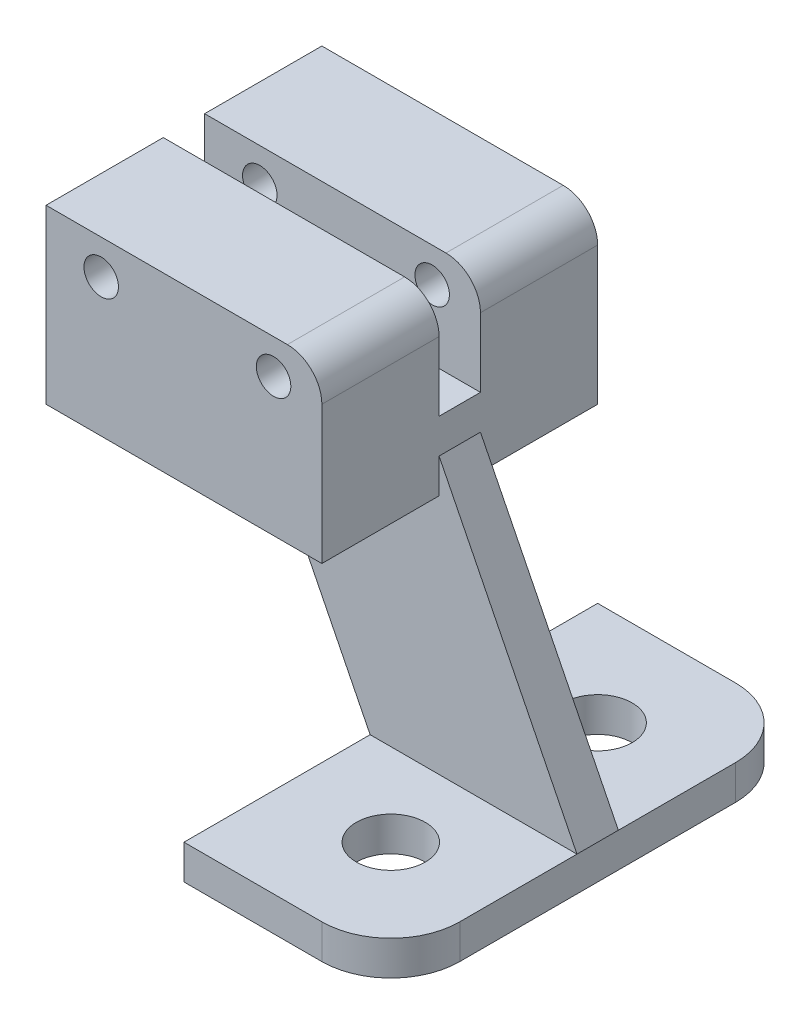
ISO-10303-21;
HEADER;
FILE_DESCRIPTION(('STEP AP214'),'2;1');
FILE_NAME('part.step','',(''),(''),'','','');
FILE_SCHEMA(('AUTOMOTIVE_DESIGN { 1 0 10303 214 1 1 1 1 }'));
ENDSEC;
DATA;
#1=APPLICATION_CONTEXT('core data for automotive mechanical design processes');
#2=APPLICATION_PROTOCOL_DEFINITION('international standard','automotive_design',2000,#1);
#3=PRODUCT_CONTEXT('',#1,'mechanical');
#4=PRODUCT('Part','Part','',(#3));
#5=PRODUCT_RELATED_PRODUCT_CATEGORY('part','',(#4));
#6=PRODUCT_DEFINITION_FORMATION('','',#4);
#7=PRODUCT_DEFINITION_CONTEXT('part definition',#1,'design');
#8=PRODUCT_DEFINITION('design','',#6,#7);
#9=PRODUCT_DEFINITION_SHAPE('','',#8);
#10=(LENGTH_UNIT() NAMED_UNIT(*) SI_UNIT(.MILLI.,.METRE.));
#11=(NAMED_UNIT(*) PLANE_ANGLE_UNIT() SI_UNIT($,.RADIAN.));
#12=(NAMED_UNIT(*) SI_UNIT($,.STERADIAN.) SOLID_ANGLE_UNIT());
#13=UNCERTAINTY_MEASURE_WITH_UNIT(LENGTH_MEASURE(1.E-05),#10,'distance_accuracy_value','');
#14=(GEOMETRIC_REPRESENTATION_CONTEXT(3) GLOBAL_UNCERTAINTY_ASSIGNED_CONTEXT((#13)) GLOBAL_UNIT_ASSIGNED_CONTEXT((#10,
#11,#12)) REPRESENTATION_CONTEXT('',''));
#15=CARTESIAN_POINT('',(0.,0.,0.));
#16=DIRECTION('',(0.,0.,1.));
#17=DIRECTION('',(1.,0.,0.));
#18=AXIS2_PLACEMENT_3D('',#15,#16,#17);
#19=CARTESIAN_POINT('',(0.,79.5806012237701,0.));
#20=DIRECTION('',(0.,1.,0.));
#21=DIRECTION('',(0.,0.,1.));
#22=AXIS2_PLACEMENT_3D('',#19,#20,#21);
#23=PLANE('',#22);
#24=DIRECTION('',(1.,0.,0.));
#25=VECTOR('',#24,1.);
#26=CARTESIAN_POINT('',(3.56486825643593,79.5806012237701,50.));
#27=LINE('',#26,#25);
#28=CARTESIAN_POINT('',(3.56486825643593,79.5806012237701,50.));
#29=VERTEX_POINT('',#28);
#30=CARTESIAN_POINT('',(38.5648682564359,79.5806012237701,50.));
#31=VERTEX_POINT('',#30);
#32=EDGE_CURVE('E263',#29,#31,#27,.T.);
#33=ORIENTED_EDGE('',*,*,#32,.T.);
#34=DIRECTION('',(0.,0.,-1.));
#35=VECTOR('',#34,1.);
#36=CARTESIAN_POINT('',(38.5648682564359,79.5806012237701,0.));
#37=LINE('',#36,#35);
#38=CARTESIAN_POINT('',(38.5648682564359,79.5806012237701,33.));
#39=VERTEX_POINT('',#38);
#40=EDGE_CURVE('E431',#31,#39,#37,.T.);
#41=ORIENTED_EDGE('',*,*,#40,.T.);
#42=DIRECTION('',(1.,0.,0.));
#43=VECTOR('',#42,1.);
#44=CARTESIAN_POINT('',(3.56486825643593,79.5806012237701,33.));
#45=LINE('',#44,#43);
#46=CARTESIAN_POINT('',(3.56486825643593,79.5806012237701,33.));
#47=VERTEX_POINT('',#46);
#48=EDGE_CURVE('E228',#47,#39,#45,.T.);
#49=ORIENTED_EDGE('',*,*,#48,.F.);
#50=DIRECTION('',(0.,0.,1.));
#51=VECTOR('',#50,1.);
#52=CARTESIAN_POINT('',(3.56486825643593,79.5806012237701,10.));
#53=LINE('',#52,#51);
#54=EDGE_CURVE('E259',#47,#29,#53,.T.);
#55=ORIENTED_EDGE('',*,*,#54,.T.);
#56=EDGE_LOOP('',(#33,#41,#49,#55));
#57=FACE_BOUND('',#56,.T.);
#58=ADVANCED_FACE('F41',(#57),#23,.T.);
#59=CARTESIAN_POINT('',(11.5648682564359,74.5806012237701,50.));
#60=DIRECTION('',(0.,0.,1.));
#61=DIRECTION('',(1.,0.,0.));
#62=AXIS2_PLACEMENT_3D('',#59,#60,#61);
#63=CYLINDRICAL_SURFACE('',#62,2.49999999999999);
#64=CARTESIAN_POINT('',(11.5648682564359,74.5806012237701,33.));
#65=DIRECTION('',(0.,0.,1.));
#66=DIRECTION('',(1.,0.,0.));
#67=AXIS2_PLACEMENT_3D('',#64,#65,#66);
#68=CIRCLE('',#67,2.49999999999999);
#69=CARTESIAN_POINT('',(14.0648682564359,74.5806012237701,33.));
#70=VERTEX_POINT('',#69);
#71=EDGE_CURVE('E239',#70,#70,#68,.F.);
#72=ORIENTED_EDGE('',*,*,#71,.T.);
#73=EDGE_LOOP('',(#72));
#74=FACE_BOUND('',#73,.T.);
#75=CARTESIAN_POINT('',(11.5648682564359,74.5806012237701,50.));
#76=DIRECTION('',(0.,0.,1.));
#77=DIRECTION('',(1.,0.,0.));
#78=AXIS2_PLACEMENT_3D('',#75,#76,#77);
#79=CIRCLE('',#78,2.49999999999999);
#80=CARTESIAN_POINT('',(14.0648682564359,74.5806012237701,50.));
#81=VERTEX_POINT('',#80);
#82=EDGE_CURVE('E248',#81,#81,#79,.T.);
#83=ORIENTED_EDGE('',*,*,#82,.T.);
#84=EDGE_LOOP('',(#83));
#85=FACE_BOUND('',#84,.T.);
#86=ADVANCED_FACE('F557',(#74,#85),#63,.F.);
#87=CARTESIAN_POINT('',(36.5648682564359,74.5806012237701,50.));
#88=DIRECTION('',(0.,0.,1.));
#89=DIRECTION('',(1.,0.,0.));
#90=AXIS2_PLACEMENT_3D('',#87,#88,#89);
#91=CYLINDRICAL_SURFACE('',#90,2.49999999999999);
#92=CARTESIAN_POINT('',(36.5648682564359,74.5806012237701,33.));
#93=DIRECTION('',(0.,0.,1.));
#94=DIRECTION('',(1.,0.,0.));
#95=AXIS2_PLACEMENT_3D('',#92,#93,#94);
#96=CIRCLE('',#95,2.49999999999999);
#97=CARTESIAN_POINT('',(39.0648682564359,74.5806012237701,33.));
#98=VERTEX_POINT('',#97);
#99=EDGE_CURVE('E238',#98,#98,#96,.F.);
#100=ORIENTED_EDGE('',*,*,#99,.T.);
#101=EDGE_LOOP('',(#100));
#102=FACE_BOUND('',#101,.T.);
#103=CARTESIAN_POINT('',(36.5648682564359,74.5806012237701,50.));
#104=DIRECTION('',(0.,0.,1.));
#105=DIRECTION('',(1.,0.,0.));
#106=AXIS2_PLACEMENT_3D('',#103,#104,#105);
#107=CIRCLE('',#106,2.49999999999999);
#108=CARTESIAN_POINT('',(39.0648682564359,74.5806012237701,50.));
#109=VERTEX_POINT('',#108);
#110=EDGE_CURVE('E243',#109,#109,#107,.T.);
#111=ORIENTED_EDGE('',*,*,#110,.T.);
#112=EDGE_LOOP('',(#111));
#113=FACE_BOUND('',#112,.T.);
#114=ADVANCED_FACE('F562',(#102,#113),#91,.F.);
#115=CARTESIAN_POINT('',(34.6841350946568,17.3420675473284,-7.));
#116=DIRECTION('',(0.894427190999916,0.447213595499958,0.));
#117=DIRECTION('',(-0.447213595499958,0.894427190999916,0.));
#118=AXIS2_PLACEMENT_3D('',#115,#116,#117);
#119=PLANE('',#118);
#120=DIRECTION('',(0.,0.,1.));
#121=VECTOR('',#120,1.);
#122=CARTESIAN_POINT('',(16.0648682564359,54.5806012237701,-7.));
#123=LINE('',#122,#121);
#124=CARTESIAN_POINT('',(16.0648682564359,54.5806012237701,27.));
#125=VERTEX_POINT('',#124);
#126=CARTESIAN_POINT('',(16.0648682564359,54.5806012237701,33.));
#127=VERTEX_POINT('',#126);
#128=EDGE_CURVE('E427',#125,#127,#123,.T.);
#129=ORIENTED_EDGE('',*,*,#128,.F.);
#130=DIRECTION('',(-0.447213595499958,0.894427190999916,0.));
#131=VECTOR('',#130,1.);
#132=CARTESIAN_POINT('',(13.5648682564359,59.5806012237701,27.));
#133=LINE('',#132,#131);
#134=CARTESIAN_POINT('',(33.5648682564359,19.5806012237701,27.));
#135=VERTEX_POINT('',#134);
#136=EDGE_CURVE('E328',#135,#125,#133,.T.);
#137=ORIENTED_EDGE('',*,*,#136,.F.);
#138=DIRECTION('',(0.,0.,-1.));
#139=VECTOR('',#138,1.);
#140=CARTESIAN_POINT('',(33.5648682564359,19.5806012237701,60.));
#141=LINE('',#140,#139);
#142=CARTESIAN_POINT('',(33.5648682564359,19.5806012237701,33.));
#143=VERTEX_POINT('',#142);
#144=EDGE_CURVE('E394',#143,#135,#141,.T.);
#145=ORIENTED_EDGE('',*,*,#144,.F.);
#146=DIRECTION('',(-0.447213595499958,0.894427190999916,0.));
#147=VECTOR('',#146,1.);
#148=CARTESIAN_POINT('',(34.6841350946568,17.3420675473284,33.));
#149=LINE('',#148,#147);
#150=EDGE_CURVE('E314',#143,#127,#149,.T.);
#151=ORIENTED_EDGE('',*,*,#150,.T.);
#152=EDGE_LOOP('',(#129,#137,#145,#151));
#153=FACE_BOUND('',#152,.T.);
#154=ADVANCED_FACE('F539',(#153),#119,.F.);
#155=CARTESIAN_POINT('',(63.5648682564359,0.,60.));
#156=DIRECTION('',(1.,0.,0.));
#157=DIRECTION('',(0.,0.,-1.));
#158=AXIS2_PLACEMENT_3D('',#155,#156,#157);
#159=PLANE('',#158);
#160=DIRECTION('',(0.,0.,-1.));
#161=VECTOR('',#160,1.);
#162=CARTESIAN_POINT('',(63.5648682564359,19.5806012237701,60.));
#163=LINE('',#162,#161);
#164=CARTESIAN_POINT('',(63.5648682564359,19.5806012237701,27.));
#165=VERTEX_POINT('',#164);
#166=CARTESIAN_POINT('',(63.5648682564359,19.5806012237701,10.));
#167=VERTEX_POINT('',#166);
#168=EDGE_CURVE('E393',#165,#167,#163,.T.);
#169=ORIENTED_EDGE('',*,*,#168,.F.);
#170=DIRECTION('',(0.,0.,1.));
#171=VECTOR('',#170,1.);
#172=CARTESIAN_POINT('',(63.5648682564359,19.5806012237701,-7.));
#173=LINE('',#172,#171);
#174=CARTESIAN_POINT('',(63.5648682564359,19.5806012237701,33.));
#175=VERTEX_POINT('',#174);
#176=EDGE_CURVE('E318',#165,#175,#173,.T.);
#177=ORIENTED_EDGE('',*,*,#176,.T.);
#178=CARTESIAN_POINT('',(63.5648682564359,19.5806012237701,50.));
#179=VERTEX_POINT('',#178);
#180=EDGE_CURVE('E395',#179,#175,#163,.T.);
#181=ORIENTED_EDGE('',*,*,#180,.F.);
#182=DIRECTION('',(0.,-1.,0.));
#183=VECTOR('',#182,1.);
#184=CARTESIAN_POINT('',(63.5648682564359,0.,50.));
#185=LINE('',#184,#183);
#186=CARTESIAN_POINT('',(63.5648682564359,14.5806012237701,50.));
#187=VERTEX_POINT('',#186);
#188=EDGE_CURVE('E409',#179,#187,#185,.T.);
#189=ORIENTED_EDGE('',*,*,#188,.T.);
#190=DIRECTION('',(0.,0.,-1.));
#191=VECTOR('',#190,1.);
#192=CARTESIAN_POINT('',(63.5648682564359,14.5806012237701,60.));
#193=LINE('',#192,#191);
#194=CARTESIAN_POINT('',(63.5648682564359,14.5806012237701,10.));
#195=VERTEX_POINT('',#194);
#196=EDGE_CURVE('E371',#187,#195,#193,.T.);
#197=ORIENTED_EDGE('',*,*,#196,.T.);
#198=DIRECTION('',(0.,-1.,0.));
#199=VECTOR('',#198,1.);
#200=CARTESIAN_POINT('',(63.5648682564359,19.5806012237701,10.));
#201=LINE('',#200,#199);
#202=EDGE_CURVE('E413',#195,#167,#201,.F.);
#203=ORIENTED_EDGE('',*,*,#202,.T.);
#204=EDGE_LOOP('',(#169,#177,#181,#189,#197,#203));
#205=FACE_BOUND('',#204,.T.);
#206=ADVANCED_FACE('F507',(#205),#159,.T.);
#207=CARTESIAN_POINT('',(63.5648682564359,59.5806012237701,33.));
#208=DIRECTION('',(0.,0.,-1.));
#209=DIRECTION('',(-1.,0.,0.));
#210=AXIS2_PLACEMENT_3D('',#207,#208,#209);
#211=PLANE('',#210);
#212=DIRECTION('',(-0.447213595499958,0.894427190999916,0.));
#213=VECTOR('',#212,1.);
#214=CARTESIAN_POINT('',(58.6841350946568,29.3420675473284,33.));
#215=LINE('',#214,#213);
#216=CARTESIAN_POINT('',(43.5648682564359,59.5806012237701,33.));
#217=VERTEX_POINT('',#216);
#218=EDGE_CURVE('E313',#175,#217,#215,.T.);
#219=ORIENTED_EDGE('',*,*,#218,.T.);
#220=DIRECTION('',(0.,-1.,0.));
#221=VECTOR('',#220,1.);
#222=CARTESIAN_POINT('',(43.5648682564359,59.5806012237701,33.));
#223=LINE('',#222,#221);
#224=CARTESIAN_POINT('',(43.5648682564359,54.5806012237701,33.));
#225=VERTEX_POINT('',#224);
#226=EDGE_CURVE('E310',#217,#225,#223,.T.);
#227=ORIENTED_EDGE('',*,*,#226,.T.);
#228=DIRECTION('',(1.,0.,0.));
#229=VECTOR('',#228,1.);
#230=CARTESIAN_POINT('',(63.5648682564359,54.5806012237701,33.));
#231=LINE('',#230,#229);
#232=EDGE_CURVE('E303',#127,#225,#231,.T.);
#233=ORIENTED_EDGE('',*,*,#232,.F.);
#234=ORIENTED_EDGE('',*,*,#150,.F.);
#235=DIRECTION('',(1.,0.,0.));
#236=VECTOR('',#235,1.);
#237=CARTESIAN_POINT('',(63.5648682564359,19.5806012237701,33.));
#238=LINE('',#237,#236);
#239=EDGE_CURVE('E333',#143,#175,#238,.T.);
#240=ORIENTED_EDGE('',*,*,#239,.T.);
#241=EDGE_LOOP('',(#219,#227,#233,#234,#240));
#242=FACE_BOUND('',#241,.T.);
#243=ADVANCED_FACE('F498',(#242),#211,.F.);
#244=CARTESIAN_POINT('',(13.5648682564359,59.5806012237701,27.));
#245=DIRECTION('',(0.,0.,1.));
#246=DIRECTION('',(1.,0.,0.));
#247=AXIS2_PLACEMENT_3D('',#244,#245,#246);
#248=PLANE('',#247);
#249=DIRECTION('',(-1.,0.,0.));
#250=VECTOR('',#249,1.);
#251=CARTESIAN_POINT('',(13.5648682564359,54.5806012237701,27.));
#252=LINE('',#251,#250);
#253=CARTESIAN_POINT('',(43.5648682564359,54.5806012237701,27.));
#254=VERTEX_POINT('',#253);
#255=EDGE_CURVE('E289',#254,#125,#252,.T.);
#256=ORIENTED_EDGE('',*,*,#255,.F.);
#257=DIRECTION('',(0.,1.,0.));
#258=VECTOR('',#257,1.);
#259=CARTESIAN_POINT('',(43.5648682564359,59.5806012237701,27.));
#260=LINE('',#259,#258);
#261=CARTESIAN_POINT('',(43.5648682564359,59.5806012237701,27.));
#262=VERTEX_POINT('',#261);
#263=EDGE_CURVE('E307',#254,#262,#260,.T.);
#264=ORIENTED_EDGE('',*,*,#263,.T.);
#265=DIRECTION('',(-0.447213595499958,0.894427190999916,0.));
#266=VECTOR('',#265,1.);
#267=CARTESIAN_POINT('',(37.5648682564359,71.5806012237701,27.));
#268=LINE('',#267,#266);
#269=EDGE_CURVE('E317',#165,#262,#268,.T.);
#270=ORIENTED_EDGE('',*,*,#269,.F.);
#271=DIRECTION('',(-1.,0.,0.));
#272=VECTOR('',#271,1.);
#273=CARTESIAN_POINT('',(13.5648682564359,19.5806012237701,27.));
#274=LINE('',#273,#272);
#275=EDGE_CURVE('E332',#165,#135,#274,.T.);
#276=ORIENTED_EDGE('',*,*,#275,.T.);
#277=ORIENTED_EDGE('',*,*,#136,.T.);
#278=EDGE_LOOP('',(#256,#264,#270,#276,#277));
#279=FACE_BOUND('',#278,.T.);
#280=ADVANCED_FACE('F537',(#279),#248,.F.);
#281=CARTESIAN_POINT('',(0.,19.5806012237701,60.));
#282=DIRECTION('',(0.,1.,0.));
#283=DIRECTION('',(0.,0.,1.));
#284=AXIS2_PLACEMENT_3D('',#281,#282,#283);
#285=PLANE('',#284);
#286=ORIENTED_EDGE('',*,*,#239,.F.);
#287=CARTESIAN_POINT('',(33.5648682564359,19.5806012237701,60.));
#288=VERTEX_POINT('',#287);
#289=EDGE_CURVE('E389',#288,#143,#141,.T.);
#290=ORIENTED_EDGE('',*,*,#289,.F.);
#291=DIRECTION('',(1.,0.,0.));
#292=VECTOR('',#291,1.);
#293=CARTESIAN_POINT('',(0.,19.5806012237701,60.));
#294=LINE('',#293,#292);
#295=CARTESIAN_POINT('',(53.5648682564359,19.5806012237701,60.));
#296=VERTEX_POINT('',#295);
#297=EDGE_CURVE('E359',#288,#296,#294,.T.);
#298=ORIENTED_EDGE('',*,*,#297,.T.);
#299=CARTESIAN_POINT('',(53.5648682564359,19.5806012237701,50.));
#300=DIRECTION('',(0.,1.,0.));
#301=DIRECTION('',(0.,0.,1.));
#302=AXIS2_PLACEMENT_3D('',#299,#300,#301);
#303=CIRCLE('',#302,10.);
#304=EDGE_CURVE('E417',#296,#179,#303,.T.);
#305=ORIENTED_EDGE('',*,*,#304,.T.);
#306=ORIENTED_EDGE('',*,*,#180,.T.);
#307=EDGE_LOOP('',(#286,#290,#298,#305,#306));
#308=FACE_BOUND('',#307,.T.);
#309=CARTESIAN_POINT('',(48.5648682564359,19.5806012237701,45.));
#310=DIRECTION('',(0.,1.,0.));
#311=DIRECTION('',(0.,0.,1.));
#312=AXIS2_PLACEMENT_3D('',#309,#310,#311);
#313=CIRCLE('',#312,4.99999999999999);
#314=CARTESIAN_POINT('',(48.5648682564359,19.5806012237701,50.));
#315=VERTEX_POINT('',#314);
#316=EDGE_CURVE('E350',#315,#315,#313,.T.);
#317=ORIENTED_EDGE('',*,*,#316,.F.);
#318=EDGE_LOOP('',(#317));
#319=FACE_BOUND('',#318,.T.);
#320=ADVANCED_FACE('F510',(#308,#319),#285,.T.);
#321=ORIENTED_EDGE('',*,*,#275,.F.);
#322=ORIENTED_EDGE('',*,*,#168,.T.);
#323=CARTESIAN_POINT('',(53.5648682564359,19.5806012237701,10.));
#324=DIRECTION('',(0.,1.,0.));
#325=DIRECTION('',(0.,0.,1.));
#326=AXIS2_PLACEMENT_3D('',#323,#324,#325);
#327=CIRCLE('',#326,10.);
#328=CARTESIAN_POINT('',(53.5648682564359,19.5806012237701,0.));
#329=VERTEX_POINT('',#328);
#330=EDGE_CURVE('E420',#167,#329,#327,.T.);
#331=ORIENTED_EDGE('',*,*,#330,.T.);
#332=DIRECTION('',(1.,0.,0.));
#333=VECTOR('',#332,1.);
#334=CARTESIAN_POINT('',(0.,19.5806012237701,0.));
#335=LINE('',#334,#333);
#336=CARTESIAN_POINT('',(33.5648682564359,19.5806012237701,0.));
#337=VERTEX_POINT('',#336);
#338=EDGE_CURVE('E358',#337,#329,#335,.T.);
#339=ORIENTED_EDGE('',*,*,#338,.F.);
#340=EDGE_CURVE('E388',#135,#337,#141,.T.);
#341=ORIENTED_EDGE('',*,*,#340,.F.);
#342=EDGE_LOOP('',(#321,#322,#331,#339,#341));
#343=FACE_BOUND('',#342,.T.);
#344=CARTESIAN_POINT('',(48.5648682564359,19.5806012237701,15.));
#345=DIRECTION('',(0.,1.,0.));
#346=DIRECTION('',(0.,0.,1.));
#347=AXIS2_PLACEMENT_3D('',#344,#345,#346);
#348=CIRCLE('',#347,4.99999999999999);
#349=CARTESIAN_POINT('',(48.5648682564359,19.5806012237701,20.));
#350=VERTEX_POINT('',#349);
#351=EDGE_CURVE('E342',#350,#350,#348,.T.);
#352=ORIENTED_EDGE('',*,*,#351,.F.);
#353=EDGE_LOOP('',(#352));
#354=FACE_BOUND('',#353,.T.);
#355=ADVANCED_FACE('F534',(#343,#354),#285,.T.);
#356=CARTESIAN_POINT('',(33.5648682564359,0.,60.));
#357=DIRECTION('',(-1.,0.,0.));
#358=DIRECTION('',(0.,0.,1.));
#359=AXIS2_PLACEMENT_3D('',#356,#357,#358);
#360=PLANE('',#359);
#361=DIRECTION('',(0.,1.,0.));
#362=VECTOR('',#361,1.);
#363=CARTESIAN_POINT('',(33.5648682564359,0.,0.));
#364=LINE('',#363,#362);
#365=CARTESIAN_POINT('',(33.5648682564359,14.5806012237701,0.));
#366=VERTEX_POINT('',#365);
#367=EDGE_CURVE('E375',#366,#337,#364,.T.);
#368=ORIENTED_EDGE('',*,*,#367,.F.);
#369=DIRECTION('',(0.,0.,-1.));
#370=VECTOR('',#369,1.);
#371=CARTESIAN_POINT('',(33.5648682564359,14.5806012237701,60.));
#372=LINE('',#371,#370);
#373=CARTESIAN_POINT('',(33.5648682564359,14.5806012237701,60.));
#374=VERTEX_POINT('',#373);
#375=EDGE_CURVE('E384',#374,#366,#372,.T.);
#376=ORIENTED_EDGE('',*,*,#375,.F.);
#377=DIRECTION('',(0.,1.,0.));
#378=VECTOR('',#377,1.);
#379=CARTESIAN_POINT('',(33.5648682564359,0.,60.));
#380=LINE('',#379,#378);
#381=EDGE_CURVE('E363',#374,#288,#380,.T.);
#382=ORIENTED_EDGE('',*,*,#381,.T.);
#383=ORIENTED_EDGE('',*,*,#289,.T.);
#384=ORIENTED_EDGE('',*,*,#144,.T.);
#385=ORIENTED_EDGE('',*,*,#340,.T.);
#386=EDGE_LOOP('',(#368,#376,#382,#383,#384,#385));
#387=FACE_BOUND('',#386,.T.);
#388=ADVANCED_FACE('F541',(#387),#360,.T.);
#389=CARTESIAN_POINT('',(0.,14.5806012237701,60.));
#390=DIRECTION('',(0.,-1.,0.));
#391=DIRECTION('',(0.,0.,-1.));
#392=AXIS2_PLACEMENT_3D('',#389,#390,#391);
#393=PLANE('',#392);
#394=CARTESIAN_POINT('',(48.5648682564359,14.5806012237701,15.));
#395=DIRECTION('',(0.,1.,0.));
#396=DIRECTION('',(0.,0.,1.));
#397=AXIS2_PLACEMENT_3D('',#394,#395,#396);
#398=CIRCLE('',#397,5.);
#399=CARTESIAN_POINT('',(48.5648682564359,14.5806012237701,20.));
#400=VERTEX_POINT('',#399);
#401=EDGE_CURVE('E346',#400,#400,#398,.T.);
#402=ORIENTED_EDGE('',*,*,#401,.T.);
#403=EDGE_LOOP('',(#402));
#404=FACE_BOUND('',#403,.T.);
#405=CARTESIAN_POINT('',(48.5648682564359,14.5806012237701,45.));
#406=DIRECTION('',(0.,1.,0.));
#407=DIRECTION('',(0.,0.,1.));
#408=AXIS2_PLACEMENT_3D('',#405,#406,#407);
#409=CIRCLE('',#408,5.);
#410=CARTESIAN_POINT('',(48.5648682564359,14.5806012237701,50.));
#411=VERTEX_POINT('',#410);
#412=EDGE_CURVE('E354',#411,#411,#409,.T.);
#413=ORIENTED_EDGE('',*,*,#412,.T.);
#414=EDGE_LOOP('',(#413));
#415=FACE_BOUND('',#414,.T.);
#416=DIRECTION('',(-1.,0.,0.));
#417=VECTOR('',#416,1.);
#418=CARTESIAN_POINT('',(0.,14.5806012237701,0.));
#419=LINE('',#418,#417);
#420=CARTESIAN_POINT('',(53.5648682564359,14.5806012237701,0.));
#421=VERTEX_POINT('',#420);
#422=EDGE_CURVE('E364',#421,#366,#419,.T.);
#423=ORIENTED_EDGE('',*,*,#422,.F.);
#424=CARTESIAN_POINT('',(53.5648682564359,14.5806012237701,10.));
#425=DIRECTION('',(0.,-1.,0.));
#426=DIRECTION('',(0.,0.,-1.));
#427=AXIS2_PLACEMENT_3D('',#424,#425,#426);
#428=CIRCLE('',#427,10.);
#429=EDGE_CURVE('E406',#421,#195,#428,.T.);
#430=ORIENTED_EDGE('',*,*,#429,.T.);
#431=ORIENTED_EDGE('',*,*,#196,.F.);
#432=CARTESIAN_POINT('',(53.5648682564359,14.5806012237701,50.));
#433=DIRECTION('',(0.,-1.,0.));
#434=DIRECTION('',(0.,0.,-1.));
#435=AXIS2_PLACEMENT_3D('',#432,#433,#434);
#436=CIRCLE('',#435,10.);
#437=CARTESIAN_POINT('',(53.5648682564359,14.5806012237701,60.));
#438=VERTEX_POINT('',#437);
#439=EDGE_CURVE('E403',#187,#438,#436,.T.);
#440=ORIENTED_EDGE('',*,*,#439,.T.);
#441=DIRECTION('',(-1.,0.,0.));
#442=VECTOR('',#441,1.);
#443=CARTESIAN_POINT('',(0.,14.5806012237701,60.));
#444=LINE('',#443,#442);
#445=EDGE_CURVE('E368',#438,#374,#444,.T.);
#446=ORIENTED_EDGE('',*,*,#445,.T.);
#447=ORIENTED_EDGE('',*,*,#375,.T.);
#448=EDGE_LOOP('',(#423,#430,#431,#440,#446,#447));
#449=FACE_BOUND('',#448,.T.);
#450=ADVANCED_FACE('F521',(#404,#415,#449),#393,.T.);
#451=CARTESIAN_POINT('',(0.,0.,60.));
#452=DIRECTION('',(0.,0.,1.));
#453=DIRECTION('',(1.,0.,0.));
#454=AXIS2_PLACEMENT_3D('',#451,#452,#453);
#455=PLANE('',#454);
#456=ORIENTED_EDGE('',*,*,#445,.F.);
#457=DIRECTION('',(0.,-1.,0.));
#458=VECTOR('',#457,1.);
#459=CARTESIAN_POINT('',(53.5648682564359,0.,60.));
#460=LINE('',#459,#458);
#461=EDGE_CURVE('E338',#438,#296,#460,.F.);
#462=ORIENTED_EDGE('',*,*,#461,.T.);
#463=ORIENTED_EDGE('',*,*,#297,.F.);
#464=ORIENTED_EDGE('',*,*,#381,.F.);
#465=EDGE_LOOP('',(#456,#462,#463,#464));
#466=FACE_BOUND('',#465,.T.);
#467=ADVANCED_FACE('F545',(#466),#455,.T.);
#468=CARTESIAN_POINT('',(0.,0.,0.));
#469=DIRECTION('',(0.,0.,1.));
#470=DIRECTION('',(1.,0.,0.));
#471=AXIS2_PLACEMENT_3D('',#468,#469,#470);
#472=PLANE('',#471);
#473=ORIENTED_EDGE('',*,*,#338,.T.);
#474=DIRECTION('',(0.,-1.,0.));
#475=VECTOR('',#474,1.);
#476=CARTESIAN_POINT('',(53.5648682564359,14.5806012237701,0.));
#477=LINE('',#476,#475);
#478=EDGE_CURVE('E399',#329,#421,#477,.T.);
#479=ORIENTED_EDGE('',*,*,#478,.T.);
#480=ORIENTED_EDGE('',*,*,#422,.T.);
#481=ORIENTED_EDGE('',*,*,#367,.T.);
#482=EDGE_LOOP('',(#473,#479,#480,#481));
#483=FACE_BOUND('',#482,.T.);
#484=ADVANCED_FACE('F528',(#483),#472,.F.);
#485=CARTESIAN_POINT('',(53.5648682564359,0.,10.));
#486=DIRECTION('',(0.,1.,0.));
#487=DIRECTION('',(0.,0.,1.));
#488=AXIS2_PLACEMENT_3D('',#485,#486,#487);
#489=CYLINDRICAL_SURFACE('',#488,10.);
#490=ORIENTED_EDGE('',*,*,#330,.F.);
#491=ORIENTED_EDGE('',*,*,#202,.F.);
#492=ORIENTED_EDGE('',*,*,#429,.F.);
#493=ORIENTED_EDGE('',*,*,#478,.F.);
#494=EDGE_LOOP('',(#490,#491,#492,#493));
#495=FACE_BOUND('',#494,.T.);
#496=ADVANCED_FACE('F526',(#495),#489,.T.);
#497=CARTESIAN_POINT('',(53.5648682564359,0.,50.));
#498=DIRECTION('',(0.,-1.,0.));
#499=DIRECTION('',(0.,0.,-1.));
#500=AXIS2_PLACEMENT_3D('',#497,#498,#499);
#501=CYLINDRICAL_SURFACE('',#500,10.);
#502=ORIENTED_EDGE('',*,*,#304,.F.);
#503=ORIENTED_EDGE('',*,*,#461,.F.);
#504=ORIENTED_EDGE('',*,*,#439,.F.);
#505=ORIENTED_EDGE('',*,*,#188,.F.);
#506=EDGE_LOOP('',(#502,#503,#504,#505));
#507=FACE_BOUND('',#506,.T.);
#508=ADVANCED_FACE('F516',(#507),#501,.T.);
#509=CARTESIAN_POINT('',(48.5648682564359,19.5806012237701,45.));
#510=DIRECTION('',(0.,1.,0.));
#511=DIRECTION('',(0.,0.,1.));
#512=AXIS2_PLACEMENT_3D('',#509,#510,#511);
#513=CYLINDRICAL_SURFACE('',#512,4.99999999999999);
#514=ORIENTED_EDGE('',*,*,#412,.F.);
#515=EDGE_LOOP('',(#514));
#516=FACE_BOUND('',#515,.T.);
#517=ORIENTED_EDGE('',*,*,#316,.T.);
#518=EDGE_LOOP('',(#517));
#519=FACE_BOUND('',#518,.T.);
#520=ADVANCED_FACE('F596',(#516,#519),#513,.F.);
#521=CARTESIAN_POINT('',(48.5648682564359,19.5806012237701,15.));
#522=DIRECTION('',(0.,1.,0.));
#523=DIRECTION('',(0.,0.,1.));
#524=AXIS2_PLACEMENT_3D('',#521,#522,#523);
#525=CYLINDRICAL_SURFACE('',#524,4.99999999999999);
#526=ORIENTED_EDGE('',*,*,#401,.F.);
#527=EDGE_LOOP('',(#526));
#528=FACE_BOUND('',#527,.T.);
#529=ORIENTED_EDGE('',*,*,#351,.T.);
#530=EDGE_LOOP('',(#529));
#531=FACE_BOUND('',#530,.T.);
#532=ADVANCED_FACE('F590',(#528,#531),#525,.F.);
#533=CARTESIAN_POINT('',(58.6841350946568,29.3420675473284,-7.));
#534=DIRECTION('',(0.894427190999916,0.447213595499958,0.));
#535=DIRECTION('',(-0.447213595499958,0.894427190999916,0.));
#536=AXIS2_PLACEMENT_3D('',#533,#534,#535);
#537=PLANE('',#536);
#538=ORIENTED_EDGE('',*,*,#269,.T.);
#539=DIRECTION('',(0.,0.,1.));
#540=VECTOR('',#539,1.);
#541=CARTESIAN_POINT('',(43.5648682564359,59.5806012237701,0.));
#542=LINE('',#541,#540);
#543=EDGE_CURVE('E337',#262,#217,#542,.T.);
#544=ORIENTED_EDGE('',*,*,#543,.T.);
#545=ORIENTED_EDGE('',*,*,#218,.F.);
#546=ORIENTED_EDGE('',*,*,#176,.F.);
#547=EDGE_LOOP('',(#538,#544,#545,#546));
#548=FACE_BOUND('',#547,.T.);
#549=ADVANCED_FACE('F502',(#548),#537,.T.);
#550=CARTESIAN_POINT('',(43.5648682564359,54.5806012237701,30.));
#551=DIRECTION('',(1.,0.,0.));
#552=DIRECTION('',(0.,0.,-1.));
#553=AXIS2_PLACEMENT_3D('',#550,#551,#552);
#554=PLANE('',#553);
#555=DIRECTION('',(0.,1.,0.));
#556=VECTOR('',#555,1.);
#557=CARTESIAN_POINT('',(43.5648682564359,54.5806012237701,10.));
#558=LINE('',#557,#556);
#559=CARTESIAN_POINT('',(43.5648682564359,54.5806012237701,10.));
#560=VERTEX_POINT('',#559);
#561=CARTESIAN_POINT('',(43.5648682564359,74.5806012237701,10.));
#562=VERTEX_POINT('',#561);
#563=EDGE_CURVE('E284',#560,#562,#558,.T.);
#564=ORIENTED_EDGE('',*,*,#563,.T.);
#565=DIRECTION('',(0.,0.,-1.));
#566=VECTOR('',#565,1.);
#567=CARTESIAN_POINT('',(43.5648682564359,74.5806012237701,30.));
#568=LINE('',#567,#566);
#569=CARTESIAN_POINT('',(43.5648682564359,74.5806012237701,27.));
#570=VERTEX_POINT('',#569);
#571=EDGE_CURVE('E50',#562,#570,#568,.F.);
#572=ORIENTED_EDGE('',*,*,#571,.T.);
#573=DIRECTION('',(0.,1.,0.));
#574=VECTOR('',#573,1.);
#575=CARTESIAN_POINT('',(43.5648682564359,79.5806012237701,27.));
#576=LINE('',#575,#574);
#577=CARTESIAN_POINT('',(43.5648682564359,64.5806012237701,27.));
#578=VERTEX_POINT('',#577);
#579=EDGE_CURVE('E215',#578,#570,#576,.T.);
#580=ORIENTED_EDGE('',*,*,#579,.F.);
#581=DIRECTION('',(0.,0.,-1.));
#582=VECTOR('',#581,1.);
#583=CARTESIAN_POINT('',(43.5648682564359,64.5806012237701,30.));
#584=LINE('',#583,#582);
#585=CARTESIAN_POINT('',(43.5648682564359,64.5806012237701,33.));
#586=VERTEX_POINT('',#585);
#587=EDGE_CURVE('E193',#586,#578,#584,.T.);
#588=ORIENTED_EDGE('',*,*,#587,.F.);
#589=DIRECTION('',(0.,-1.,0.));
#590=VECTOR('',#589,1.);
#591=CARTESIAN_POINT('',(43.5648682564359,64.5806012237701,33.));
#592=LINE('',#591,#590);
#593=CARTESIAN_POINT('',(43.5648682564359,74.5806012237701,33.));
#594=VERTEX_POINT('',#593);
#595=EDGE_CURVE('E212',#594,#586,#592,.T.);
#596=ORIENTED_EDGE('',*,*,#595,.F.);
#597=DIRECTION('',(0.,0.,-1.));
#598=VECTOR('',#597,1.);
#599=CARTESIAN_POINT('',(43.5648682564359,74.5806012237701,30.));
#600=LINE('',#599,#598);
#601=CARTESIAN_POINT('',(43.5648682564359,74.5806012237701,50.));
#602=VERTEX_POINT('',#601);
#603=EDGE_CURVE('E447',#594,#602,#600,.F.);
#604=ORIENTED_EDGE('',*,*,#603,.T.);
#605=DIRECTION('',(0.,1.,0.));
#606=VECTOR('',#605,1.);
#607=CARTESIAN_POINT('',(43.5648682564359,54.5806012237701,50.));
#608=LINE('',#607,#606);
#609=CARTESIAN_POINT('',(43.5648682564359,54.5806012237701,50.));
#610=VERTEX_POINT('',#609);
#611=EDGE_CURVE('E285',#610,#602,#608,.T.);
#612=ORIENTED_EDGE('',*,*,#611,.F.);
#613=DIRECTION('',(0.,0.,-1.));
#614=VECTOR('',#613,1.);
#615=CARTESIAN_POINT('',(43.5648682564359,54.5806012237701,50.));
#616=LINE('',#615,#614);
#617=EDGE_CURVE('E268',#610,#225,#616,.T.);
#618=ORIENTED_EDGE('',*,*,#617,.T.);
#619=ORIENTED_EDGE('',*,*,#226,.F.);
#620=ORIENTED_EDGE('',*,*,#543,.F.);
#621=ORIENTED_EDGE('',*,*,#263,.F.);
#622=EDGE_CURVE('E267',#254,#560,#616,.T.);
#623=ORIENTED_EDGE('',*,*,#622,.T.);
#624=EDGE_LOOP('',(#564,#572,#580,#588,#596,#604,#612,#618,#619,#620,#621,#623));
#625=FACE_BOUND('',#624,.T.);
#626=ADVANCED_FACE('F481',(#625),#554,.T.);
#627=CARTESIAN_POINT('',(0.,54.5806012237701,0.));
#628=DIRECTION('',(0.,1.,0.));
#629=DIRECTION('',(0.,0.,1.));
#630=AXIS2_PLACEMENT_3D('',#627,#628,#629);
#631=PLANE('',#630);
#632=ORIENTED_EDGE('',*,*,#128,.T.);
#633=ORIENTED_EDGE('',*,*,#232,.T.);
#634=ORIENTED_EDGE('',*,*,#617,.F.);
#635=DIRECTION('',(1.,0.,0.));
#636=VECTOR('',#635,1.);
#637=CARTESIAN_POINT('',(3.56486825643593,54.5806012237701,50.));
#638=LINE('',#637,#636);
#639=CARTESIAN_POINT('',(3.56486825643593,54.5806012237701,50.));
#640=VERTEX_POINT('',#639);
#641=EDGE_CURVE('E280',#640,#610,#638,.T.);
#642=ORIENTED_EDGE('',*,*,#641,.F.);
#643=DIRECTION('',(0.,0.,1.));
#644=VECTOR('',#643,1.);
#645=CARTESIAN_POINT('',(3.56486825643593,54.5806012237701,10.));
#646=LINE('',#645,#644);
#647=CARTESIAN_POINT('',(3.56486825643593,54.5806012237701,10.));
#648=VERTEX_POINT('',#647);
#649=EDGE_CURVE('E276',#648,#640,#646,.T.);
#650=ORIENTED_EDGE('',*,*,#649,.F.);
#651=DIRECTION('',(-1.,0.,0.));
#652=VECTOR('',#651,1.);
#653=CARTESIAN_POINT('',(43.5648682564359,54.5806012237701,10.));
#654=LINE('',#653,#652);
#655=EDGE_CURVE('E272',#560,#648,#654,.T.);
#656=ORIENTED_EDGE('',*,*,#655,.F.);
#657=ORIENTED_EDGE('',*,*,#622,.F.);
#658=ORIENTED_EDGE('',*,*,#255,.T.);
#659=EDGE_LOOP('',(#632,#633,#634,#642,#650,#656,#657,#658));
#660=FACE_BOUND('',#659,.T.);
#661=ADVANCED_FACE('F490',(#660),#631,.F.);
#662=CARTESIAN_POINT('',(3.56486825643593,54.5806012237701,50.));
#663=DIRECTION('',(0.,0.,1.));
#664=DIRECTION('',(1.,0.,0.));
#665=AXIS2_PLACEMENT_3D('',#662,#663,#664);
#666=PLANE('',#665);
#667=ORIENTED_EDGE('',*,*,#110,.F.);
#668=EDGE_LOOP('',(#667));
#669=FACE_BOUND('',#668,.T.);
#670=ORIENTED_EDGE('',*,*,#82,.F.);
#671=EDGE_LOOP('',(#670));
#672=FACE_BOUND('',#671,.T.);
#673=ORIENTED_EDGE('',*,*,#611,.T.);
#674=CARTESIAN_POINT('',(38.5648682564359,74.5806012237701,50.));
#675=DIRECTION('',(0.,0.,1.));
#676=DIRECTION('',(1.,0.,0.));
#677=AXIS2_PLACEMENT_3D('',#674,#675,#676);
#678=CIRCLE('',#677,5.);
#679=EDGE_CURVE('E450',#602,#31,#678,.T.);
#680=ORIENTED_EDGE('',*,*,#679,.T.);
#681=ORIENTED_EDGE('',*,*,#32,.F.);
#682=DIRECTION('',(0.,1.,0.));
#683=VECTOR('',#682,1.);
#684=CARTESIAN_POINT('',(3.56486825643593,54.5806012237701,50.));
#685=LINE('',#684,#683);
#686=EDGE_CURVE('E290',#640,#29,#685,.T.);
#687=ORIENTED_EDGE('',*,*,#686,.F.);
#688=ORIENTED_EDGE('',*,*,#641,.T.);
#689=EDGE_LOOP('',(#673,#680,#681,#687,#688));
#690=FACE_BOUND('',#689,.T.);
#691=ADVANCED_FACE('F472',(#669,#672,#690),#666,.T.);
#692=CARTESIAN_POINT('',(3.56486825643593,54.5806012237701,10.));
#693=DIRECTION('',(-1.,0.,0.));
#694=DIRECTION('',(0.,0.,1.));
#695=AXIS2_PLACEMENT_3D('',#692,#693,#694);
#696=PLANE('',#695);
#697=DIRECTION('',(0.,-1.,0.));
#698=VECTOR('',#697,1.);
#699=CARTESIAN_POINT('',(3.56486825643593,64.5806012237701,33.));
#700=LINE('',#699,#698);
#701=CARTESIAN_POINT('',(3.56486825643593,64.5806012237701,33.));
#702=VERTEX_POINT('',#701);
#703=EDGE_CURVE('E197',#47,#702,#700,.T.);
#704=ORIENTED_EDGE('',*,*,#703,.T.);
#705=DIRECTION('',(0.,0.,-1.));
#706=VECTOR('',#705,1.);
#707=CARTESIAN_POINT('',(3.56486825643593,64.5806012237701,30.));
#708=LINE('',#707,#706);
#709=CARTESIAN_POINT('',(3.56486825643593,64.5806012237701,27.));
#710=VERTEX_POINT('',#709);
#711=EDGE_CURVE('E190',#702,#710,#708,.T.);
#712=ORIENTED_EDGE('',*,*,#711,.T.);
#713=DIRECTION('',(0.,1.,0.));
#714=VECTOR('',#713,1.);
#715=CARTESIAN_POINT('',(3.56486825643593,79.5806012237701,27.));
#716=LINE('',#715,#714);
#717=CARTESIAN_POINT('',(3.56486825643593,79.5806012237701,27.));
#718=VERTEX_POINT('',#717);
#719=EDGE_CURVE('E200',#710,#718,#716,.T.);
#720=ORIENTED_EDGE('',*,*,#719,.T.);
#721=CARTESIAN_POINT('',(3.56486825643593,79.5806012237701,10.));
#722=VERTEX_POINT('',#721);
#723=EDGE_CURVE('E260',#722,#718,#53,.T.);
#724=ORIENTED_EDGE('',*,*,#723,.F.);
#725=DIRECTION('',(0.,1.,0.));
#726=VECTOR('',#725,1.);
#727=CARTESIAN_POINT('',(3.56486825643593,54.5806012237701,10.));
#728=LINE('',#727,#726);
#729=EDGE_CURVE('E294',#648,#722,#728,.T.);
#730=ORIENTED_EDGE('',*,*,#729,.F.);
#731=ORIENTED_EDGE('',*,*,#649,.T.);
#732=ORIENTED_EDGE('',*,*,#686,.T.);
#733=ORIENTED_EDGE('',*,*,#54,.F.);
#734=EDGE_LOOP('',(#704,#712,#720,#724,#730,#731,#732,#733));
#735=FACE_BOUND('',#734,.T.);
#736=ADVANCED_FACE('F209',(#735),#696,.T.);
#737=CARTESIAN_POINT('',(43.5648682564359,54.5806012237701,10.));
#738=DIRECTION('',(0.,0.,-1.));
#739=DIRECTION('',(-1.,0.,0.));
#740=AXIS2_PLACEMENT_3D('',#737,#738,#739);
#741=PLANE('',#740);
#742=CARTESIAN_POINT('',(36.5648682564359,74.5806012237701,9.99999999999999));
#743=DIRECTION('',(0.,0.,-1.));
#744=DIRECTION('',(-1.,0.,0.));
#745=AXIS2_PLACEMENT_3D('',#742,#743,#744);
#746=CIRCLE('',#745,2.49999999999999);
#747=CARTESIAN_POINT('',(34.0648682564359,74.5806012237701,9.99999999999999));
#748=VERTEX_POINT('',#747);
#749=EDGE_CURVE('E247',#748,#748,#746,.T.);
#750=ORIENTED_EDGE('',*,*,#749,.F.);
#751=EDGE_LOOP('',(#750));
#752=FACE_BOUND('',#751,.T.);
#753=CARTESIAN_POINT('',(11.5648682564359,74.5806012237701,10.));
#754=DIRECTION('',(0.,0.,-1.));
#755=DIRECTION('',(-1.,0.,0.));
#756=AXIS2_PLACEMENT_3D('',#753,#754,#755);
#757=CIRCLE('',#756,2.49999999999999);
#758=CARTESIAN_POINT('',(9.06486825643594,74.5806012237701,10.));
#759=VERTEX_POINT('',#758);
#760=EDGE_CURVE('E252',#759,#759,#757,.T.);
#761=ORIENTED_EDGE('',*,*,#760,.F.);
#762=EDGE_LOOP('',(#761));
#763=FACE_BOUND('',#762,.T.);
#764=DIRECTION('',(-1.,0.,0.));
#765=VECTOR('',#764,1.);
#766=CARTESIAN_POINT('',(43.5648682564359,79.5806012237701,10.));
#767=LINE('',#766,#765);
#768=CARTESIAN_POINT('',(38.5648682564359,79.5806012237701,10.));
#769=VERTEX_POINT('',#768);
#770=EDGE_CURVE('E256',#769,#722,#767,.T.);
#771=ORIENTED_EDGE('',*,*,#770,.F.);
#772=CARTESIAN_POINT('',(38.5648682564359,74.5806012237701,10.));
#773=DIRECTION('',(0.,0.,-1.));
#774=DIRECTION('',(-1.,0.,0.));
#775=AXIS2_PLACEMENT_3D('',#772,#773,#774);
#776=CIRCLE('',#775,5.);
#777=EDGE_CURVE('E64',#769,#562,#776,.T.);
#778=ORIENTED_EDGE('',*,*,#777,.T.);
#779=ORIENTED_EDGE('',*,*,#563,.F.);
#780=ORIENTED_EDGE('',*,*,#655,.T.);
#781=ORIENTED_EDGE('',*,*,#729,.T.);
#782=EDGE_LOOP('',(#771,#778,#779,#780,#781));
#783=FACE_BOUND('',#782,.T.);
#784=ADVANCED_FACE('F487',(#752,#763,#783),#741,.T.);
#785=DIRECTION('',(1.,0.,0.));
#786=VECTOR('',#785,1.);
#787=CARTESIAN_POINT('',(3.56486825643593,79.5806012237701,27.));
#788=LINE('',#787,#786);
#789=CARTESIAN_POINT('',(38.5648682564359,79.5806012237701,27.));
#790=VERTEX_POINT('',#789);
#791=EDGE_CURVE('E196',#718,#790,#788,.T.);
#792=ORIENTED_EDGE('',*,*,#791,.T.);
#793=DIRECTION('',(0.,0.,-1.));
#794=VECTOR('',#793,1.);
#795=CARTESIAN_POINT('',(38.5648682564359,79.5806012237701,0.));
#796=LINE('',#795,#794);
#797=EDGE_CURVE('E453',#790,#769,#796,.T.);
#798=ORIENTED_EDGE('',*,*,#797,.T.);
#799=ORIENTED_EDGE('',*,*,#770,.T.);
#800=ORIENTED_EDGE('',*,*,#723,.T.);
#801=EDGE_LOOP('',(#792,#798,#799,#800));
#802=FACE_BOUND('',#801,.T.);
#803=ADVANCED_FACE('F486',(#802),#23,.T.);
#804=CARTESIAN_POINT('',(11.5648682564359,74.5806012237701,27.));
#805=DIRECTION('',(0.,0.,-1.));
#806=DIRECTION('',(-1.,0.,0.));
#807=AXIS2_PLACEMENT_3D('',#804,#805,#806);
#808=CIRCLE('',#807,2.49999999999999);
#809=CARTESIAN_POINT('',(9.06486825643594,74.5806012237701,27.));
#810=VERTEX_POINT('',#809);
#811=EDGE_CURVE('E234',#810,#810,#808,.F.);
#812=ORIENTED_EDGE('',*,*,#811,.T.);
#813=EDGE_LOOP('',(#812));
#814=FACE_BOUND('',#813,.T.);
#815=ORIENTED_EDGE('',*,*,#760,.T.);
#816=EDGE_LOOP('',(#815));
#817=FACE_BOUND('',#816,.T.);
#818=ADVANCED_FACE('F565',(#814,#817),#63,.F.);
#819=CARTESIAN_POINT('',(36.5648682564359,74.5806012237701,27.));
#820=DIRECTION('',(0.,0.,-1.));
#821=DIRECTION('',(-1.,0.,0.));
#822=AXIS2_PLACEMENT_3D('',#819,#820,#821);
#823=CIRCLE('',#822,2.49999999999999);
#824=CARTESIAN_POINT('',(34.0648682564359,74.5806012237701,27.));
#825=VERTEX_POINT('',#824);
#826=EDGE_CURVE('E227',#825,#825,#823,.F.);
#827=ORIENTED_EDGE('',*,*,#826,.T.);
#828=EDGE_LOOP('',(#827));
#829=FACE_BOUND('',#828,.T.);
#830=ORIENTED_EDGE('',*,*,#749,.T.);
#831=EDGE_LOOP('',(#830));
#832=FACE_BOUND('',#831,.T.);
#833=ADVANCED_FACE('F572',(#829,#832),#91,.F.);
#834=CARTESIAN_POINT('',(3.56486825643593,64.5806012237701,33.));
#835=DIRECTION('',(0.,0.,1.));
#836=DIRECTION('',(1.,0.,0.));
#837=AXIS2_PLACEMENT_3D('',#834,#835,#836);
#838=PLANE('',#837);
#839=ORIENTED_EDGE('',*,*,#99,.F.);
#840=EDGE_LOOP('',(#839));
#841=FACE_BOUND('',#840,.T.);
#842=ORIENTED_EDGE('',*,*,#48,.T.);
#843=CARTESIAN_POINT('',(38.5648682564359,74.5806012237701,33.));
#844=DIRECTION('',(0.,0.,1.));
#845=DIRECTION('',(1.,0.,0.));
#846=AXIS2_PLACEMENT_3D('',#843,#844,#845);
#847=CIRCLE('',#846,5.);
#848=EDGE_CURVE('E444',#39,#594,#847,.F.);
#849=ORIENTED_EDGE('',*,*,#848,.T.);
#850=ORIENTED_EDGE('',*,*,#595,.T.);
#851=DIRECTION('',(1.,0.,0.));
#852=VECTOR('',#851,1.);
#853=CARTESIAN_POINT('',(3.56486825643593,64.5806012237701,33.));
#854=LINE('',#853,#852);
#855=EDGE_CURVE('E224',#702,#586,#854,.T.);
#856=ORIENTED_EDGE('',*,*,#855,.F.);
#857=ORIENTED_EDGE('',*,*,#703,.F.);
#858=EDGE_LOOP('',(#842,#849,#850,#856,#857));
#859=FACE_BOUND('',#858,.T.);
#860=ORIENTED_EDGE('',*,*,#71,.F.);
#861=EDGE_LOOP('',(#860));
#862=FACE_BOUND('',#861,.T.);
#863=ADVANCED_FACE('F478',(#841,#859,#862),#838,.F.);
#864=CARTESIAN_POINT('',(3.56486825643593,79.5806012237701,27.));
#865=DIRECTION('',(0.,0.,-1.));
#866=DIRECTION('',(-1.,0.,0.));
#867=AXIS2_PLACEMENT_3D('',#864,#865,#866);
#868=PLANE('',#867);
#869=ORIENTED_EDGE('',*,*,#826,.F.);
#870=EDGE_LOOP('',(#869));
#871=FACE_BOUND('',#870,.T.);
#872=ORIENTED_EDGE('',*,*,#579,.T.);
#873=CARTESIAN_POINT('',(38.5648682564359,74.5806012237701,27.));
#874=DIRECTION('',(0.,0.,-1.));
#875=DIRECTION('',(-1.,0.,0.));
#876=AXIS2_PLACEMENT_3D('',#873,#874,#875);
#877=CIRCLE('',#876,5.);
#878=EDGE_CURVE('E11',#570,#790,#877,.F.);
#879=ORIENTED_EDGE('',*,*,#878,.T.);
#880=ORIENTED_EDGE('',*,*,#791,.F.);
#881=ORIENTED_EDGE('',*,*,#719,.F.);
#882=DIRECTION('',(1.,0.,0.));
#883=VECTOR('',#882,1.);
#884=CARTESIAN_POINT('',(3.56486825643593,64.5806012237701,27.));
#885=LINE('',#884,#883);
#886=EDGE_CURVE('E185',#710,#578,#885,.T.);
#887=ORIENTED_EDGE('',*,*,#886,.T.);
#888=EDGE_LOOP('',(#872,#879,#880,#881,#887));
#889=FACE_BOUND('',#888,.T.);
#890=ORIENTED_EDGE('',*,*,#811,.F.);
#891=EDGE_LOOP('',(#890));
#892=FACE_BOUND('',#891,.T.);
#893=ADVANCED_FACE('F201',(#871,#889,#892),#868,.F.);
#894=CARTESIAN_POINT('',(3.56486825643593,64.5806012237701,30.));
#895=DIRECTION('',(0.,-1.,0.));
#896=DIRECTION('',(0.,0.,-1.));
#897=AXIS2_PLACEMENT_3D('',#894,#895,#896);
#898=PLANE('',#897);
#899=ORIENTED_EDGE('',*,*,#587,.T.);
#900=ORIENTED_EDGE('',*,*,#886,.F.);
#901=ORIENTED_EDGE('',*,*,#711,.F.);
#902=ORIENTED_EDGE('',*,*,#855,.T.);
#903=EDGE_LOOP('',(#899,#900,#901,#902));
#904=FACE_BOUND('',#903,.T.);
#905=ADVANCED_FACE('F187',(#904),#898,.F.);
#906=CARTESIAN_POINT('',(38.5648682564359,74.5806012237701,0.));
#907=DIRECTION('',(0.,0.,-1.));
#908=DIRECTION('',(-1.,0.,0.));
#909=AXIS2_PLACEMENT_3D('',#906,#907,#908);
#910=CYLINDRICAL_SURFACE('',#909,5.);
#911=ORIENTED_EDGE('',*,*,#679,.F.);
#912=ORIENTED_EDGE('',*,*,#603,.F.);
#913=ORIENTED_EDGE('',*,*,#848,.F.);
#914=ORIENTED_EDGE('',*,*,#40,.F.);
#915=EDGE_LOOP('',(#911,#912,#913,#914));
#916=FACE_BOUND('',#915,.T.);
#917=ADVANCED_FACE('F476',(#916),#910,.T.);
#918=CARTESIAN_POINT('',(38.5648682564359,74.5806012237701,0.));
#919=DIRECTION('',(0.,0.,-1.));
#920=DIRECTION('',(-1.,0.,0.));
#921=AXIS2_PLACEMENT_3D('',#918,#919,#920);
#922=CYLINDRICAL_SURFACE('',#921,5.);
#923=ORIENTED_EDGE('',*,*,#878,.F.);
#924=ORIENTED_EDGE('',*,*,#571,.F.);
#925=ORIENTED_EDGE('',*,*,#777,.F.);
#926=ORIENTED_EDGE('',*,*,#797,.F.);
#927=EDGE_LOOP('',(#923,#924,#925,#926));
#928=FACE_BOUND('',#927,.T.);
#929=ADVANCED_FACE('F43',(#928),#922,.T.);
#930=CLOSED_SHELL('',(#58,#86,#114,#154,#206,#243,#280,#320,#355,#388,#450,#467,#484,#496,#508,
#520,#532,#549,#626,#661,#691,#736,#784,#803,#818,#833,#863,#893,#905,#917,#929));
#931=MANIFOLD_SOLID_BREP('B2',#930);
#932=ADVANCED_BREP_SHAPE_REPRESENTATION('',(#18,#931),#14);
#933=SHAPE_DEFINITION_REPRESENTATION(#9,#932);
ENDSEC;
END-ISO-10303-21;
